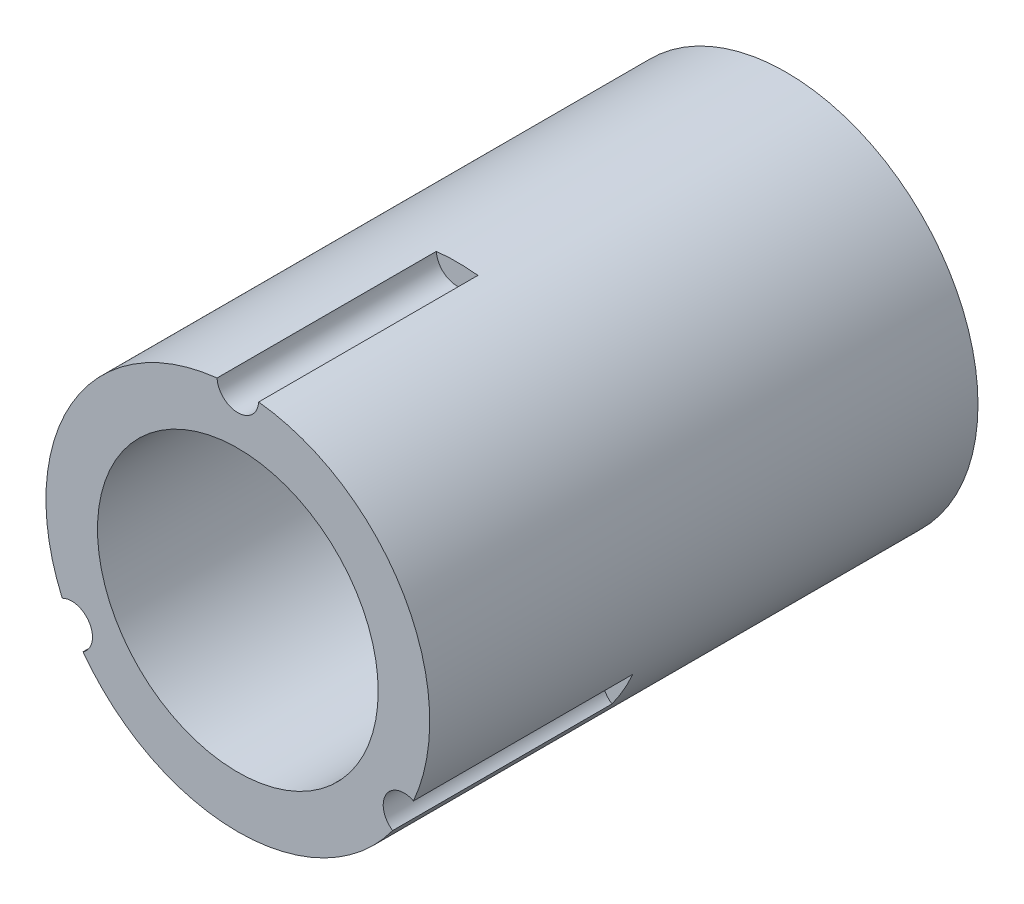
ISO-10303-21;
HEADER;
FILE_DESCRIPTION(('STEP AP214'),'2;1');
FILE_NAME('part.step','',(''),(''),'','','');
FILE_SCHEMA(('AUTOMOTIVE_DESIGN { 1 0 10303 214 1 1 1 1 }'));
ENDSEC;
DATA;
#1=APPLICATION_CONTEXT('core data for automotive mechanical design processes');
#2=APPLICATION_PROTOCOL_DEFINITION('international standard','automotive_design',2000,#1);
#3=PRODUCT_CONTEXT('',#1,'mechanical');
#4=PRODUCT('Part','Part','',(#3));
#5=PRODUCT_RELATED_PRODUCT_CATEGORY('part','',(#4));
#6=PRODUCT_DEFINITION_FORMATION('','',#4);
#7=PRODUCT_DEFINITION_CONTEXT('part definition',#1,'design');
#8=PRODUCT_DEFINITION('design','',#6,#7);
#9=PRODUCT_DEFINITION_SHAPE('','',#8);
#10=(LENGTH_UNIT() NAMED_UNIT(*) SI_UNIT(.MILLI.,.METRE.));
#11=(NAMED_UNIT(*) PLANE_ANGLE_UNIT() SI_UNIT($,.RADIAN.));
#12=(NAMED_UNIT(*) SI_UNIT($,.STERADIAN.) SOLID_ANGLE_UNIT());
#13=UNCERTAINTY_MEASURE_WITH_UNIT(LENGTH_MEASURE(1.E-05),#10,'distance_accuracy_value','');
#14=(GEOMETRIC_REPRESENTATION_CONTEXT(3) GLOBAL_UNCERTAINTY_ASSIGNED_CONTEXT((#13)) GLOBAL_UNIT_ASSIGNED_CONTEXT((#10,
#11,#12)) REPRESENTATION_CONTEXT('',''));
#15=CARTESIAN_POINT('',(0.,0.,0.));
#16=DIRECTION('',(0.,0.,1.));
#17=DIRECTION('',(1.,0.,0.));
#18=AXIS2_PLACEMENT_3D('',#15,#16,#17);
#19=CARTESIAN_POINT('',(0.,0.,50.));
#20=DIRECTION('',(0.,0.,-1.));
#21=DIRECTION('',(-1.,0.,0.));
#22=AXIS2_PLACEMENT_3D('',#19,#20,#21);
#23=CYLINDRICAL_SURFACE('',#22,17.5);
#24=CARTESIAN_POINT('',(0.,0.,30.));
#25=DIRECTION('',(0.,0.,1.));
#26=DIRECTION('',(1.,0.,0.));
#27=AXIS2_PLACEMENT_3D('',#24,#25,#26);
#28=CIRCLE('',#27,17.5);
#29=CARTESIAN_POINT('',(14.117521060442,-10.3414505321052,30.));
#30=VERTEX_POINT('',#29);
#31=CARTESIAN_POINT('',(16.0147194030041,-7.05540661075213,30.));
#32=VERTEX_POINT('',#31);
#33=EDGE_CURVE('E11',#30,#32,#28,.T.);
#34=ORIENTED_EDGE('',*,*,#33,.F.);
#35=DIRECTION('',(0.,0.,1.));
#36=VECTOR('',#35,1.);
#37=CARTESIAN_POINT('',(14.117521060442,-10.3414505321052,40.));
#38=LINE('',#37,#36);
#39=CARTESIAN_POINT('',(14.117521060442,-10.3414505321052,50.));
#40=VERTEX_POINT('',#39);
#41=EDGE_CURVE('E117',#30,#40,#38,.T.);
#42=ORIENTED_EDGE('',*,*,#41,.T.);
#43=CARTESIAN_POINT('',(0.,0.,50.));
#44=DIRECTION('',(0.,0.,1.));
#45=DIRECTION('',(1.,0.,0.));
#46=AXIS2_PLACEMENT_3D('',#43,#44,#45);
#47=CIRCLE('',#46,17.5);
#48=CARTESIAN_POINT('',(-14.117521060442,-10.3414505321052,50.));
#49=VERTEX_POINT('',#48);
#50=EDGE_CURVE('E113',#49,#40,#47,.T.);
#51=ORIENTED_EDGE('',*,*,#50,.F.);
#52=DIRECTION('',(0.,0.,1.));
#53=VECTOR('',#52,1.);
#54=CARTESIAN_POINT('',(-14.117521060442,-10.3414505321052,40.));
#55=LINE('',#54,#53);
#56=CARTESIAN_POINT('',(-14.117521060442,-10.3414505321052,30.));
#57=VERTEX_POINT('',#56);
#58=EDGE_CURVE('E54',#49,#57,#55,.F.);
#59=ORIENTED_EDGE('',*,*,#58,.T.);
#60=CARTESIAN_POINT('',(0.,0.,30.));
#61=DIRECTION('',(0.,0.,1.));
#62=DIRECTION('',(1.,0.,0.));
#63=AXIS2_PLACEMENT_3D('',#60,#61,#62);
#64=CIRCLE('',#63,17.5);
#65=CARTESIAN_POINT('',(-16.0147194030041,-7.05540661075213,30.));
#66=VERTEX_POINT('',#65);
#67=EDGE_CURVE('E96',#66,#57,#64,.T.);
#68=ORIENTED_EDGE('',*,*,#67,.F.);
#69=DIRECTION('',(0.,0.,1.));
#70=VECTOR('',#69,1.);
#71=CARTESIAN_POINT('',(-16.0147194030041,-7.05540661075213,40.));
#72=LINE('',#71,#70);
#73=CARTESIAN_POINT('',(-16.0147194030041,-7.05540661075213,50.));
#74=VERTEX_POINT('',#73);
#75=EDGE_CURVE('E83',#66,#74,#72,.T.);
#76=ORIENTED_EDGE('',*,*,#75,.T.);
#77=CARTESIAN_POINT('',(-1.89719834256211,17.3968571428571,50.));
#78=VERTEX_POINT('',#77);
#79=EDGE_CURVE('E103',#78,#74,#47,.T.);
#80=ORIENTED_EDGE('',*,*,#79,.F.);
#81=DIRECTION('',(0.,0.,1.));
#82=VECTOR('',#81,1.);
#83=CARTESIAN_POINT('',(-1.89719834256211,17.3968571428571,40.));
#84=LINE('',#83,#82);
#85=CARTESIAN_POINT('',(-1.89719834256211,17.3968571428571,30.));
#86=VERTEX_POINT('',#85);
#87=EDGE_CURVE('E92',#78,#86,#84,.F.);
#88=ORIENTED_EDGE('',*,*,#87,.T.);
#89=CARTESIAN_POINT('',(0.,0.,30.));
#90=DIRECTION('',(0.,0.,1.));
#91=DIRECTION('',(1.,0.,0.));
#92=AXIS2_PLACEMENT_3D('',#89,#90,#91);
#93=CIRCLE('',#92,17.5);
#94=CARTESIAN_POINT('',(1.89719834256211,17.3968571428571,30.));
#95=VERTEX_POINT('',#94);
#96=EDGE_CURVE('E39',#95,#86,#93,.T.);
#97=ORIENTED_EDGE('',*,*,#96,.F.);
#98=DIRECTION('',(0.,0.,1.));
#99=VECTOR('',#98,1.);
#100=CARTESIAN_POINT('',(1.89719834256211,17.3968571428571,40.));
#101=LINE('',#100,#99);
#102=CARTESIAN_POINT('',(1.89719834256211,17.3968571428571,50.));
#103=VERTEX_POINT('',#102);
#104=EDGE_CURVE('E123',#95,#103,#101,.T.);
#105=ORIENTED_EDGE('',*,*,#104,.T.);
#106=CARTESIAN_POINT('',(16.0147194030041,-7.05540661075213,50.));
#107=VERTEX_POINT('',#106);
#108=EDGE_CURVE('E109',#107,#103,#47,.T.);
#109=ORIENTED_EDGE('',*,*,#108,.F.);
#110=DIRECTION('',(0.,0.,1.));
#111=VECTOR('',#110,1.);
#112=CARTESIAN_POINT('',(16.0147194030041,-7.05540661075213,40.));
#113=LINE('',#112,#111);
#114=EDGE_CURVE('E46',#107,#32,#113,.F.);
#115=ORIENTED_EDGE('',*,*,#114,.T.);
#116=EDGE_LOOP('',(#34,#42,#51,#59,#68,#76,#80,#88,#97,#105,#109,#115));
#117=FACE_BOUND('',#116,.T.);
#118=CARTESIAN_POINT('',(0.,0.,0.));
#119=DIRECTION('',(0.,0.,1.));
#120=DIRECTION('',(1.,0.,0.));
#121=AXIS2_PLACEMENT_3D('',#118,#119,#120);
#122=CIRCLE('',#121,17.5);
#123=CARTESIAN_POINT('',(17.5,0.,0.));
#124=VERTEX_POINT('',#123);
#125=EDGE_CURVE('E106',#124,#124,#122,.T.);
#126=ORIENTED_EDGE('',*,*,#125,.T.);
#127=EDGE_LOOP('',(#126));
#128=FACE_BOUND('',#127,.T.);
#129=ADVANCED_FACE('F32',(#117,#128),#23,.T.);
#130=CARTESIAN_POINT('',(0.,0.,50.));
#131=DIRECTION('',(0.,0.,1.));
#132=DIRECTION('',(1.,0.,0.));
#133=AXIS2_PLACEMENT_3D('',#130,#131,#132);
#134=PLANE('',#133);
#135=CARTESIAN_POINT('',(15.1554445662276,-8.75000000000007,50.));
#136=DIRECTION('',(0.,0.,1.));
#137=DIRECTION('',(1.,0.,0.));
#138=AXIS2_PLACEMENT_3D('',#135,#136,#137);
#139=CIRCLE('',#138,1.9);
#140=EDGE_CURVE('E134',#107,#40,#139,.T.);
#141=ORIENTED_EDGE('',*,*,#140,.F.);
#142=ORIENTED_EDGE('',*,*,#108,.T.);
#143=CARTESIAN_POINT('',(0.,17.5,50.));
#144=DIRECTION('',(0.,0.,1.));
#145=DIRECTION('',(1.,0.,0.));
#146=AXIS2_PLACEMENT_3D('',#143,#144,#145);
#147=CIRCLE('',#146,1.9);
#148=EDGE_CURVE('E97',#78,#103,#147,.T.);
#149=ORIENTED_EDGE('',*,*,#148,.F.);
#150=ORIENTED_EDGE('',*,*,#79,.T.);
#151=CARTESIAN_POINT('',(-15.1554445662276,-8.75000000000007,50.));
#152=DIRECTION('',(0.,0.,1.));
#153=DIRECTION('',(1.,0.,0.));
#154=AXIS2_PLACEMENT_3D('',#151,#152,#153);
#155=CIRCLE('',#154,1.9);
#156=EDGE_CURVE('E87',#49,#74,#155,.T.);
#157=ORIENTED_EDGE('',*,*,#156,.F.);
#158=ORIENTED_EDGE('',*,*,#50,.T.);
#159=EDGE_LOOP('',(#141,#142,#149,#150,#157,#158));
#160=FACE_BOUND('',#159,.T.);
#161=CARTESIAN_POINT('',(0.,0.,50.));
#162=DIRECTION('',(0.,0.,1.));
#163=DIRECTION('',(1.,0.,0.));
#164=AXIS2_PLACEMENT_3D('',#161,#162,#163);
#165=CIRCLE('',#164,12.8);
#166=CARTESIAN_POINT('',(12.8,0.,50.));
#167=VERTEX_POINT('',#166);
#168=EDGE_CURVE('E114',#167,#167,#165,.T.);
#169=ORIENTED_EDGE('',*,*,#168,.F.);
#170=EDGE_LOOP('',(#169));
#171=FACE_BOUND('',#170,.T.);
#172=ADVANCED_FACE('F144',(#160,#171),#134,.T.);
#173=CARTESIAN_POINT('',(0.,0.,0.));
#174=DIRECTION('',(0.,0.,1.));
#175=DIRECTION('',(1.,0.,0.));
#176=AXIS2_PLACEMENT_3D('',#173,#174,#175);
#177=PLANE('',#176);
#178=CARTESIAN_POINT('',(0.,0.,0.));
#179=DIRECTION('',(0.,0.,1.));
#180=DIRECTION('',(1.,0.,0.));
#181=AXIS2_PLACEMENT_3D('',#178,#179,#180);
#182=CIRCLE('',#181,12.8);
#183=CARTESIAN_POINT('',(12.8,0.,0.));
#184=VERTEX_POINT('',#183);
#185=EDGE_CURVE('E110',#184,#184,#182,.T.);
#186=ORIENTED_EDGE('',*,*,#185,.T.);
#187=EDGE_LOOP('',(#186));
#188=FACE_BOUND('',#187,.T.);
#189=ORIENTED_EDGE('',*,*,#125,.F.);
#190=EDGE_LOOP('',(#189));
#191=FACE_BOUND('',#190,.T.);
#192=ADVANCED_FACE('F160',(#188,#191),#177,.F.);
#193=CARTESIAN_POINT('',(0.,0.,0.));
#194=DIRECTION('',(0.,0.,1.));
#195=DIRECTION('',(1.,0.,0.));
#196=AXIS2_PLACEMENT_3D('',#193,#194,#195);
#197=CYLINDRICAL_SURFACE('',#196,12.8);
#198=ORIENTED_EDGE('',*,*,#185,.F.);
#199=EDGE_LOOP('',(#198));
#200=FACE_BOUND('',#199,.T.);
#201=ORIENTED_EDGE('',*,*,#168,.T.);
#202=EDGE_LOOP('',(#201));
#203=FACE_BOUND('',#202,.T.);
#204=ADVANCED_FACE('F166',(#200,#203),#197,.F.);
#205=CARTESIAN_POINT('',(-15.1554445662276,-8.75000000000007,30.));
#206=DIRECTION('',(0.,0.,1.));
#207=DIRECTION('',(1.,0.,0.));
#208=AXIS2_PLACEMENT_3D('',#205,#206,#207);
#209=PLANE('',#208);
#210=ORIENTED_EDGE('',*,*,#67,.T.);
#211=CARTESIAN_POINT('',(-15.1554445662276,-8.75000000000007,30.));
#212=DIRECTION('',(0.,0.,1.));
#213=DIRECTION('',(1.,0.,0.));
#214=AXIS2_PLACEMENT_3D('',#211,#212,#213);
#215=CIRCLE('',#214,1.9);
#216=EDGE_CURVE('E86',#57,#66,#215,.T.);
#217=ORIENTED_EDGE('',*,*,#216,.T.);
#218=EDGE_LOOP('',(#210,#217));
#219=FACE_BOUND('',#218,.T.);
#220=ADVANCED_FACE('F95',(#219),#209,.T.);
#221=CARTESIAN_POINT('',(-15.1554445662276,-8.75000000000007,30.));
#222=DIRECTION('',(0.,0.,1.));
#223=DIRECTION('',(1.,0.,0.));
#224=AXIS2_PLACEMENT_3D('',#221,#222,#223);
#225=CYLINDRICAL_SURFACE('',#224,1.9);
#226=ORIENTED_EDGE('',*,*,#216,.F.);
#227=ORIENTED_EDGE('',*,*,#58,.F.);
#228=ORIENTED_EDGE('',*,*,#156,.T.);
#229=ORIENTED_EDGE('',*,*,#75,.F.);
#230=EDGE_LOOP('',(#226,#227,#228,#229));
#231=FACE_BOUND('',#230,.T.);
#232=ADVANCED_FACE('F85',(#231),#225,.F.);
#233=CARTESIAN_POINT('',(0.,17.5,30.));
#234=DIRECTION('',(0.,0.,1.));
#235=DIRECTION('',(1.,0.,0.));
#236=AXIS2_PLACEMENT_3D('',#233,#234,#235);
#237=PLANE('',#236);
#238=ORIENTED_EDGE('',*,*,#96,.T.);
#239=CARTESIAN_POINT('',(0.,17.5,30.));
#240=DIRECTION('',(0.,0.,1.));
#241=DIRECTION('',(1.,0.,0.));
#242=AXIS2_PLACEMENT_3D('',#239,#240,#241);
#243=CIRCLE('',#242,1.9);
#244=EDGE_CURVE('E131',#86,#95,#243,.T.);
#245=ORIENTED_EDGE('',*,*,#244,.T.);
#246=EDGE_LOOP('',(#238,#245));
#247=FACE_BOUND('',#246,.T.);
#248=ADVANCED_FACE('F174',(#247),#237,.T.);
#249=CARTESIAN_POINT('',(0.,17.5,30.));
#250=DIRECTION('',(0.,0.,1.));
#251=DIRECTION('',(1.,0.,0.));
#252=AXIS2_PLACEMENT_3D('',#249,#250,#251);
#253=CYLINDRICAL_SURFACE('',#252,1.9);
#254=ORIENTED_EDGE('',*,*,#244,.F.);
#255=ORIENTED_EDGE('',*,*,#87,.F.);
#256=ORIENTED_EDGE('',*,*,#148,.T.);
#257=ORIENTED_EDGE('',*,*,#104,.F.);
#258=EDGE_LOOP('',(#254,#255,#256,#257));
#259=FACE_BOUND('',#258,.T.);
#260=ADVANCED_FACE('F152',(#259),#253,.F.);
#261=CARTESIAN_POINT('',(15.1554445662276,-8.75000000000007,30.));
#262=DIRECTION('',(0.,0.,1.));
#263=DIRECTION('',(1.,0.,0.));
#264=AXIS2_PLACEMENT_3D('',#261,#262,#263);
#265=PLANE('',#264);
#266=ORIENTED_EDGE('',*,*,#33,.T.);
#267=CARTESIAN_POINT('',(15.1554445662276,-8.75000000000007,30.));
#268=DIRECTION('',(0.,0.,1.));
#269=DIRECTION('',(1.,0.,0.));
#270=AXIS2_PLACEMENT_3D('',#267,#268,#269);
#271=CIRCLE('',#270,1.9);
#272=EDGE_CURVE('E128',#32,#30,#271,.T.);
#273=ORIENTED_EDGE('',*,*,#272,.T.);
#274=EDGE_LOOP('',(#266,#273));
#275=FACE_BOUND('',#274,.T.);
#276=ADVANCED_FACE('F138',(#275),#265,.T.);
#277=CARTESIAN_POINT('',(15.1554445662276,-8.75000000000007,30.));
#278=DIRECTION('',(0.,0.,1.));
#279=DIRECTION('',(1.,0.,0.));
#280=AXIS2_PLACEMENT_3D('',#277,#278,#279);
#281=CYLINDRICAL_SURFACE('',#280,1.9);
#282=ORIENTED_EDGE('',*,*,#272,.F.);
#283=ORIENTED_EDGE('',*,*,#114,.F.);
#284=ORIENTED_EDGE('',*,*,#140,.T.);
#285=ORIENTED_EDGE('',*,*,#41,.F.);
#286=EDGE_LOOP('',(#282,#283,#284,#285));
#287=FACE_BOUND('',#286,.T.);
#288=ADVANCED_FACE('F146',(#287),#281,.F.);
#289=CLOSED_SHELL('',(#129,#172,#192,#204,#220,#232,#248,#260,#276,#288));
#290=MANIFOLD_SOLID_BREP('B2',#289);
#291=ADVANCED_BREP_SHAPE_REPRESENTATION('',(#18,#290),#14);
#292=SHAPE_DEFINITION_REPRESENTATION(#9,#291);
ENDSEC;
END-ISO-10303-21;
